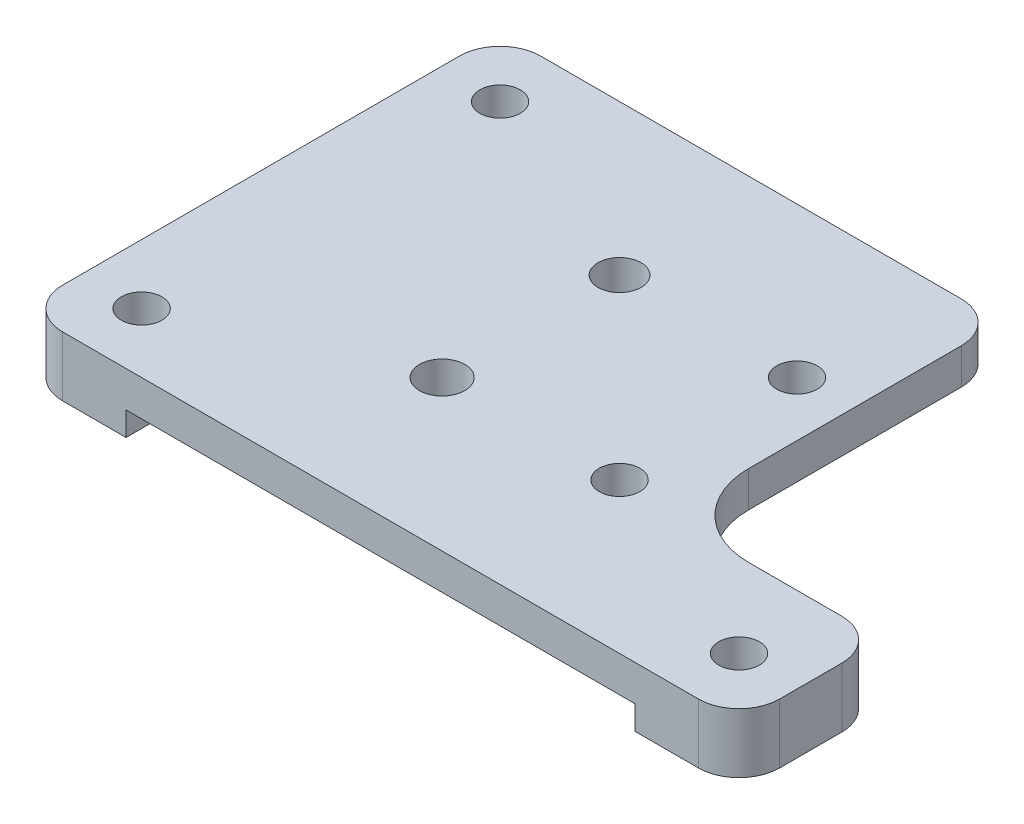
ISO-10303-21;
HEADER;
FILE_DESCRIPTION(('STEP AP214'),'2;1');
FILE_NAME('part.step','',(''),(''),'','','');
FILE_SCHEMA(('AUTOMOTIVE_DESIGN { 1 0 10303 214 1 1 1 1 }'));
ENDSEC;
DATA;
#1=APPLICATION_CONTEXT('core data for automotive mechanical design processes');
#2=APPLICATION_PROTOCOL_DEFINITION('international standard','automotive_design',2000,#1);
#3=PRODUCT_CONTEXT('',#1,'mechanical');
#4=PRODUCT('Part','Part','',(#3));
#5=PRODUCT_RELATED_PRODUCT_CATEGORY('part','',(#4));
#6=PRODUCT_DEFINITION_FORMATION('','',#4);
#7=PRODUCT_DEFINITION_CONTEXT('part definition',#1,'design');
#8=PRODUCT_DEFINITION('design','',#6,#7);
#9=PRODUCT_DEFINITION_SHAPE('','',#8);
#10=(LENGTH_UNIT() NAMED_UNIT(*) SI_UNIT(.MILLI.,.METRE.));
#11=(NAMED_UNIT(*) PLANE_ANGLE_UNIT() SI_UNIT($,.RADIAN.));
#12=(NAMED_UNIT(*) SI_UNIT($,.STERADIAN.) SOLID_ANGLE_UNIT());
#13=UNCERTAINTY_MEASURE_WITH_UNIT(LENGTH_MEASURE(1.E-05),#10,'distance_accuracy_value','');
#14=(GEOMETRIC_REPRESENTATION_CONTEXT(3) GLOBAL_UNCERTAINTY_ASSIGNED_CONTEXT((#13)) GLOBAL_UNIT_ASSIGNED_CONTEXT((#10,
#11,#12)) REPRESENTATION_CONTEXT('',''));
#15=CARTESIAN_POINT('',(0.,0.,0.));
#16=DIRECTION('',(0.,0.,1.));
#17=DIRECTION('',(1.,0.,0.));
#18=AXIS2_PLACEMENT_3D('',#15,#16,#17);
#19=CARTESIAN_POINT('',(0.,0.,0.));
#20=DIRECTION('',(0.,1.,0.));
#21=DIRECTION('',(0.,0.,1.));
#22=AXIS2_PLACEMENT_3D('',#19,#20,#21);
#23=PLANE('',#22);
#24=CARTESIAN_POINT('',(-7.425,0.,-7.425));
#25=DIRECTION('',(0.,1.,0.));
#26=DIRECTION('',(0.,0.,1.));
#27=AXIS2_PLACEMENT_3D('',#24,#25,#26);
#28=CIRCLE('',#27,1.8);
#29=CARTESIAN_POINT('',(-7.425,0.,-5.625));
#30=VERTEX_POINT('',#29);
#31=EDGE_CURVE('E811',#30,#30,#28,.T.);
#32=ORIENTED_EDGE('',*,*,#31,.T.);
#33=EDGE_LOOP('',(#32));
#34=FACE_BOUND('',#33,.T.);
#35=CARTESIAN_POINT('',(-7.425,0.,7.425));
#36=DIRECTION('',(0.,1.,0.));
#37=DIRECTION('',(0.,0.,1.));
#38=AXIS2_PLACEMENT_3D('',#35,#36,#37);
#39=CIRCLE('',#38,1.9);
#40=CARTESIAN_POINT('',(-7.425,0.,9.325));
#41=VERTEX_POINT('',#40);
#42=EDGE_CURVE('E805',#41,#41,#39,.T.);
#43=ORIENTED_EDGE('',*,*,#42,.T.);
#44=EDGE_LOOP('',(#43));
#45=FACE_BOUND('',#44,.T.);
#46=CARTESIAN_POINT('',(7.425,0.,-7.425));
#47=DIRECTION('',(0.,1.,0.));
#48=DIRECTION('',(0.,0.,1.));
#49=AXIS2_PLACEMENT_3D('',#46,#47,#48);
#50=CIRCLE('',#49,1.7);
#51=CARTESIAN_POINT('',(7.425,0.,-5.725));
#52=VERTEX_POINT('',#51);
#53=EDGE_CURVE('E290',#52,#52,#50,.T.);
#54=ORIENTED_EDGE('',*,*,#53,.T.);
#55=EDGE_LOOP('',(#54));
#56=FACE_BOUND('',#55,.T.);
#57=CARTESIAN_POINT('',(7.425,0.,7.425));
#58=DIRECTION('',(0.,1.,0.));
#59=DIRECTION('',(0.,0.,1.));
#60=AXIS2_PLACEMENT_3D('',#57,#58,#59);
#61=CIRCLE('',#60,1.7);
#62=CARTESIAN_POINT('',(7.425,0.,9.125));
#63=VERTEX_POINT('',#62);
#64=EDGE_CURVE('E337',#63,#63,#61,.T.);
#65=ORIENTED_EDGE('',*,*,#64,.T.);
#66=EDGE_LOOP('',(#65));
#67=FACE_BOUND('',#66,.T.);
#68=DIRECTION('',(1.,0.,0.));
#69=VECTOR('',#68,1.);
#70=CARTESIAN_POINT('',(0.,0.,-20.));
#71=LINE('',#70,#69);
#72=CARTESIAN_POINT('',(-21.3,0.,-20.));
#73=VERTEX_POINT('',#72);
#74=CARTESIAN_POINT('',(8.6,0.,-20.));
#75=VERTEX_POINT('',#74);
#76=EDGE_CURVE('E284',#73,#75,#71,.T.);
#77=ORIENTED_EDGE('',*,*,#76,.T.);
#78=CARTESIAN_POINT('',(8.6,0.,-16.6));
#79=DIRECTION('',(0.,1.,0.));
#80=DIRECTION('',(0.,0.,1.));
#81=AXIS2_PLACEMENT_3D('',#78,#79,#80);
#82=CIRCLE('',#81,3.4);
#83=CARTESIAN_POINT('',(12.,0.,-16.6));
#84=VERTEX_POINT('',#83);
#85=EDGE_CURVE('E362',#75,#84,#82,.F.);
#86=ORIENTED_EDGE('',*,*,#85,.T.);
#87=DIRECTION('',(0.,0.,-1.));
#88=VECTOR('',#87,1.);
#89=CARTESIAN_POINT('',(12.,0.,0.));
#90=LINE('',#89,#88);
#91=CARTESIAN_POINT('',(12.,0.,1.20000000000001));
#92=VERTEX_POINT('',#91);
#93=EDGE_CURVE('E215',#92,#84,#90,.T.);
#94=ORIENTED_EDGE('',*,*,#93,.F.);
#95=CARTESIAN_POINT('',(18.8,0.,1.20000000000001));
#96=DIRECTION('',(0.,1.,0.));
#97=DIRECTION('',(0.,0.,1.));
#98=AXIS2_PLACEMENT_3D('',#95,#96,#97);
#99=CIRCLE('',#98,6.8);
#100=CARTESIAN_POINT('',(18.8,0.,8.00000000000001));
#101=VERTEX_POINT('',#100);
#102=EDGE_CURVE('E211',#92,#101,#99,.T.);
#103=ORIENTED_EDGE('',*,*,#102,.T.);
#104=DIRECTION('',(1.,0.,0.));
#105=VECTOR('',#104,1.);
#106=CARTESIAN_POINT('',(0.,0.,8.00000000000001));
#107=LINE('',#106,#105);
#108=CARTESIAN_POINT('',(21.3,0.,8.00000000000001));
#109=VERTEX_POINT('',#108);
#110=EDGE_CURVE('E203',#101,#109,#107,.T.);
#111=ORIENTED_EDGE('',*,*,#110,.T.);
#112=DIRECTION('',(0.,0.,-1.));
#113=VECTOR('',#112,1.);
#114=CARTESIAN_POINT('',(21.3,0.,20.));
#115=LINE('',#114,#113);
#116=CARTESIAN_POINT('',(21.3,0.,20.));
#117=VERTEX_POINT('',#116);
#118=EDGE_CURVE('E208',#117,#109,#115,.T.);
#119=ORIENTED_EDGE('',*,*,#118,.F.);
#120=DIRECTION('',(1.,0.,0.));
#121=VECTOR('',#120,1.);
#122=CARTESIAN_POINT('',(0.,0.,20.));
#123=LINE('',#122,#121);
#124=CARTESIAN_POINT('',(-21.3,0.,20.));
#125=VERTEX_POINT('',#124);
#126=EDGE_CURVE('E216',#125,#117,#123,.T.);
#127=ORIENTED_EDGE('',*,*,#126,.F.);
#128=DIRECTION('',(0.,0.,-1.));
#129=VECTOR('',#128,1.);
#130=CARTESIAN_POINT('',(-21.3,0.,20.));
#131=LINE('',#130,#129);
#132=EDGE_CURVE('E260',#125,#73,#131,.T.);
#133=ORIENTED_EDGE('',*,*,#132,.T.);
#134=EDGE_LOOP('',(#77,#86,#94,#103,#111,#119,#127,#133));
#135=FACE_BOUND('',#134,.T.);
#136=ADVANCED_FACE('F89',(#34,#45,#56,#67,#135),#23,.F.);
#137=CARTESIAN_POINT('',(0.,3.,-20.));
#138=DIRECTION('',(0.,0.,-1.));
#139=DIRECTION('',(-1.,0.,0.));
#140=AXIS2_PLACEMENT_3D('',#137,#138,#139);
#141=PLANE('',#140);
#142=DIRECTION('',(1.,0.,0.));
#143=VECTOR('',#142,1.);
#144=CARTESIAN_POINT('',(0.,3.,-20.));
#145=LINE('',#144,#143);
#146=CARTESIAN_POINT('',(-26.6,3.,-20.));
#147=VERTEX_POINT('',#146);
#148=CARTESIAN_POINT('',(8.6,3.,-20.));
#149=VERTEX_POINT('',#148);
#150=EDGE_CURVE('E285',#147,#149,#145,.T.);
#151=ORIENTED_EDGE('',*,*,#150,.T.);
#152=DIRECTION('',(0.,-1.,0.));
#153=VECTOR('',#152,1.);
#154=CARTESIAN_POINT('',(8.6,0.,-20.));
#155=LINE('',#154,#153);
#156=EDGE_CURVE('E358',#149,#75,#155,.T.);
#157=ORIENTED_EDGE('',*,*,#156,.T.);
#158=ORIENTED_EDGE('',*,*,#76,.F.);
#159=DIRECTION('',(0.,1.,0.));
#160=VECTOR('',#159,1.);
#161=CARTESIAN_POINT('',(-21.3,-2.,-20.));
#162=LINE('',#161,#160);
#163=CARTESIAN_POINT('',(-21.3,-2.,-20.));
#164=VERTEX_POINT('',#163);
#165=EDGE_CURVE('E281',#164,#73,#162,.T.);
#166=ORIENTED_EDGE('',*,*,#165,.F.);
#167=DIRECTION('',(1.,0.,0.));
#168=VECTOR('',#167,1.);
#169=CARTESIAN_POINT('',(-30.,-2.,-20.));
#170=LINE('',#169,#168);
#171=CARTESIAN_POINT('',(-26.6,-2.,-20.));
#172=VERTEX_POINT('',#171);
#173=EDGE_CURVE('E261',#172,#164,#170,.T.);
#174=ORIENTED_EDGE('',*,*,#173,.F.);
#175=DIRECTION('',(0.,-1.,0.));
#176=VECTOR('',#175,1.);
#177=CARTESIAN_POINT('',(-26.6,3.,-20.));
#178=LINE('',#177,#176);
#179=EDGE_CURVE('E355',#172,#147,#178,.F.);
#180=ORIENTED_EDGE('',*,*,#179,.T.);
#181=EDGE_LOOP('',(#151,#157,#158,#166,#174,#180));
#182=FACE_BOUND('',#181,.T.);
#183=ADVANCED_FACE('F447',(#182),#141,.T.);
#184=CARTESIAN_POINT('',(-30.,3.,0.));
#185=DIRECTION('',(1.,0.,0.));
#186=DIRECTION('',(0.,0.,-1.));
#187=AXIS2_PLACEMENT_3D('',#184,#185,#186);
#188=PLANE('',#187);
#189=DIRECTION('',(0.,0.,1.));
#190=VECTOR('',#189,1.);
#191=CARTESIAN_POINT('',(-30.,3.,0.));
#192=LINE('',#191,#190);
#193=CARTESIAN_POINT('',(-30.,3.,-16.6));
#194=VERTEX_POINT('',#193);
#195=CARTESIAN_POINT('',(-30.,3.,16.6));
#196=VERTEX_POINT('',#195);
#197=EDGE_CURVE('E289',#194,#196,#192,.T.);
#198=ORIENTED_EDGE('',*,*,#197,.F.);
#199=DIRECTION('',(0.,-1.,0.));
#200=VECTOR('',#199,1.);
#201=CARTESIAN_POINT('',(-30.,-2.,-16.6));
#202=LINE('',#201,#200);
#203=CARTESIAN_POINT('',(-30.,-2.,-16.6));
#204=VERTEX_POINT('',#203);
#205=EDGE_CURVE('E386',#194,#204,#202,.T.);
#206=ORIENTED_EDGE('',*,*,#205,.T.);
#207=DIRECTION('',(0.,0.,-1.));
#208=VECTOR('',#207,1.);
#209=CARTESIAN_POINT('',(-30.,-2.,20.));
#210=LINE('',#209,#208);
#211=CARTESIAN_POINT('',(-30.,-2.,16.6));
#212=VERTEX_POINT('',#211);
#213=EDGE_CURVE('E271',#212,#204,#210,.T.);
#214=ORIENTED_EDGE('',*,*,#213,.F.);
#215=DIRECTION('',(0.,-1.,0.));
#216=VECTOR('',#215,1.);
#217=CARTESIAN_POINT('',(-30.,3.,16.6));
#218=LINE('',#217,#216);
#219=EDGE_CURVE('E383',#212,#196,#218,.F.);
#220=ORIENTED_EDGE('',*,*,#219,.T.);
#221=EDGE_LOOP('',(#198,#206,#214,#220));
#222=FACE_BOUND('',#221,.T.);
#223=ADVANCED_FACE('F438',(#222),#188,.F.);
#224=CARTESIAN_POINT('',(0.,3.,20.));
#225=DIRECTION('',(0.,0.,-1.));
#226=DIRECTION('',(-1.,0.,0.));
#227=AXIS2_PLACEMENT_3D('',#224,#225,#226);
#228=PLANE('',#227);
#229=DIRECTION('',(1.,0.,0.));
#230=VECTOR('',#229,1.);
#231=CARTESIAN_POINT('',(0.,3.,20.));
#232=LINE('',#231,#230);
#233=CARTESIAN_POINT('',(-26.6,3.,20.));
#234=VERTEX_POINT('',#233);
#235=CARTESIAN_POINT('',(26.6,3.,20.));
#236=VERTEX_POINT('',#235);
#237=EDGE_CURVE('E294',#234,#236,#232,.T.);
#238=ORIENTED_EDGE('',*,*,#237,.F.);
#239=DIRECTION('',(0.,-1.,0.));
#240=VECTOR('',#239,1.);
#241=CARTESIAN_POINT('',(-26.6,3.,20.));
#242=LINE('',#241,#240);
#243=CARTESIAN_POINT('',(-26.6,-2.,20.));
#244=VERTEX_POINT('',#243);
#245=EDGE_CURVE('E399',#234,#244,#242,.T.);
#246=ORIENTED_EDGE('',*,*,#245,.T.);
#247=DIRECTION('',(1.,0.,0.));
#248=VECTOR('',#247,1.);
#249=CARTESIAN_POINT('',(-30.,-2.,20.));
#250=LINE('',#249,#248);
#251=CARTESIAN_POINT('',(-21.3,-2.,20.));
#252=VERTEX_POINT('',#251);
#253=EDGE_CURVE('E268',#244,#252,#250,.T.);
#254=ORIENTED_EDGE('',*,*,#253,.T.);
#255=DIRECTION('',(0.,1.,0.));
#256=VECTOR('',#255,1.);
#257=CARTESIAN_POINT('',(-21.3,-2.,20.));
#258=LINE('',#257,#256);
#259=EDGE_CURVE('E275',#252,#125,#258,.T.);
#260=ORIENTED_EDGE('',*,*,#259,.T.);
#261=ORIENTED_EDGE('',*,*,#126,.T.);
#262=DIRECTION('',(0.,1.,0.));
#263=VECTOR('',#262,1.);
#264=CARTESIAN_POINT('',(21.3,-2.,20.));
#265=LINE('',#264,#263);
#266=CARTESIAN_POINT('',(21.3,-2.,20.));
#267=VERTEX_POINT('',#266);
#268=EDGE_CURVE('E229',#267,#117,#265,.T.);
#269=ORIENTED_EDGE('',*,*,#268,.F.);
#270=DIRECTION('',(-1.,0.,0.));
#271=VECTOR('',#270,1.);
#272=CARTESIAN_POINT('',(30.,-2.,20.));
#273=LINE('',#272,#271);
#274=CARTESIAN_POINT('',(26.6,-2.,20.));
#275=VERTEX_POINT('',#274);
#276=EDGE_CURVE('E248',#275,#267,#273,.T.);
#277=ORIENTED_EDGE('',*,*,#276,.F.);
#278=DIRECTION('',(0.,-1.,0.));
#279=VECTOR('',#278,1.);
#280=CARTESIAN_POINT('',(26.6,3.,20.));
#281=LINE('',#280,#279);
#282=EDGE_CURVE('E396',#275,#236,#281,.F.);
#283=ORIENTED_EDGE('',*,*,#282,.T.);
#284=EDGE_LOOP('',(#238,#246,#254,#260,#261,#269,#277,#283));
#285=FACE_BOUND('',#284,.T.);
#286=ADVANCED_FACE('F420',(#285),#228,.F.);
#287=CARTESIAN_POINT('',(30.,3.,0.));
#288=DIRECTION('',(-1.,0.,0.));
#289=DIRECTION('',(0.,0.,1.));
#290=AXIS2_PLACEMENT_3D('',#287,#288,#289);
#291=PLANE('',#290);
#292=DIRECTION('',(0.,0.,-1.));
#293=VECTOR('',#292,1.);
#294=CARTESIAN_POINT('',(30.,-2.,20.));
#295=LINE('',#294,#293);
#296=CARTESIAN_POINT('',(30.,-2.,16.6));
#297=VERTEX_POINT('',#296);
#298=CARTESIAN_POINT('',(30.,-2.,11.4));
#299=VERTEX_POINT('',#298);
#300=EDGE_CURVE('E228',#297,#299,#295,.T.);
#301=ORIENTED_EDGE('',*,*,#300,.T.);
#302=DIRECTION('',(0.,-1.,0.));
#303=VECTOR('',#302,1.);
#304=CARTESIAN_POINT('',(30.,3.,11.4));
#305=LINE('',#304,#303);
#306=CARTESIAN_POINT('',(30.,3.,11.4));
#307=VERTEX_POINT('',#306);
#308=EDGE_CURVE('E12',#299,#307,#305,.F.);
#309=ORIENTED_EDGE('',*,*,#308,.T.);
#310=DIRECTION('',(0.,0.,-1.));
#311=VECTOR('',#310,1.);
#312=CARTESIAN_POINT('',(30.,3.,0.));
#313=LINE('',#312,#311);
#314=CARTESIAN_POINT('',(30.,3.,16.6));
#315=VERTEX_POINT('',#314);
#316=EDGE_CURVE('E298',#315,#307,#313,.T.);
#317=ORIENTED_EDGE('',*,*,#316,.F.);
#318=DIRECTION('',(0.,-1.,0.));
#319=VECTOR('',#318,1.);
#320=CARTESIAN_POINT('',(30.,3.,16.6));
#321=LINE('',#320,#319);
#322=EDGE_CURVE('E98',#315,#297,#321,.T.);
#323=ORIENTED_EDGE('',*,*,#322,.T.);
#324=EDGE_LOOP('',(#301,#309,#317,#323));
#325=FACE_BOUND('',#324,.T.);
#326=ADVANCED_FACE('F412',(#325),#291,.F.);
#327=CARTESIAN_POINT('',(0.,3.,8.00000000000001));
#328=DIRECTION('',(0.,0.,-1.));
#329=DIRECTION('',(-1.,0.,0.));
#330=AXIS2_PLACEMENT_3D('',#327,#328,#329);
#331=PLANE('',#330);
#332=DIRECTION('',(1.,0.,0.));
#333=VECTOR('',#332,1.);
#334=CARTESIAN_POINT('',(0.,3.,8.00000000000001));
#335=LINE('',#334,#333);
#336=CARTESIAN_POINT('',(18.8,3.,8.00000000000001));
#337=VERTEX_POINT('',#336);
#338=CARTESIAN_POINT('',(26.6,3.,8.00000000000001));
#339=VERTEX_POINT('',#338);
#340=EDGE_CURVE('E302',#337,#339,#335,.T.);
#341=ORIENTED_EDGE('',*,*,#340,.T.);
#342=DIRECTION('',(0.,-1.,0.));
#343=VECTOR('',#342,1.);
#344=CARTESIAN_POINT('',(26.6,-2.,8.00000000000001));
#345=LINE('',#344,#343);
#346=CARTESIAN_POINT('',(26.6,-2.,8.00000000000001));
#347=VERTEX_POINT('',#346);
#348=EDGE_CURVE('E403',#339,#347,#345,.T.);
#349=ORIENTED_EDGE('',*,*,#348,.T.);
#350=DIRECTION('',(-1.,0.,0.));
#351=VECTOR('',#350,1.);
#352=CARTESIAN_POINT('',(30.,-2.,8.00000000000001));
#353=LINE('',#352,#351);
#354=CARTESIAN_POINT('',(21.3,-2.,8.00000000000001));
#355=VERTEX_POINT('',#354);
#356=EDGE_CURVE('E223',#347,#355,#353,.T.);
#357=ORIENTED_EDGE('',*,*,#356,.T.);
#358=DIRECTION('',(0.,1.,0.));
#359=VECTOR('',#358,1.);
#360=CARTESIAN_POINT('',(21.3,-2.,8.00000000000001));
#361=LINE('',#360,#359);
#362=EDGE_CURVE('E219',#355,#109,#361,.T.);
#363=ORIENTED_EDGE('',*,*,#362,.T.);
#364=ORIENTED_EDGE('',*,*,#110,.F.);
#365=DIRECTION('',(0.,-1.,0.));
#366=VECTOR('',#365,1.);
#367=CARTESIAN_POINT('',(18.8,3.,8.00000000000001));
#368=LINE('',#367,#366);
#369=EDGE_CURVE('E347',#101,#337,#368,.F.);
#370=ORIENTED_EDGE('',*,*,#369,.T.);
#371=EDGE_LOOP('',(#341,#349,#357,#363,#364,#370));
#372=FACE_BOUND('',#371,.T.);
#373=ADVANCED_FACE('F221',(#372),#331,.T.);
#374=CARTESIAN_POINT('',(7.425,3.,7.425));
#375=DIRECTION('',(0.,-1.,0.));
#376=DIRECTION('',(0.,0.,-1.));
#377=AXIS2_PLACEMENT_3D('',#374,#375,#376);
#378=CYLINDRICAL_SURFACE('',#377,1.7);
#379=CARTESIAN_POINT('',(7.425,3.,7.425));
#380=DIRECTION('',(0.,1.,0.));
#381=DIRECTION('',(0.,0.,1.));
#382=AXIS2_PLACEMENT_3D('',#379,#380,#381);
#383=CIRCLE('',#382,1.7);
#384=CARTESIAN_POINT('',(7.425,3.,9.125));
#385=VERTEX_POINT('',#384);
#386=EDGE_CURVE('E321',#385,#385,#383,.T.);
#387=ORIENTED_EDGE('',*,*,#386,.T.);
#388=EDGE_LOOP('',(#387));
#389=FACE_BOUND('',#388,.T.);
#390=ORIENTED_EDGE('',*,*,#64,.F.);
#391=EDGE_LOOP('',(#390));
#392=FACE_BOUND('',#391,.T.);
#393=ADVANCED_FACE('F495',(#389,#392),#378,.F.);
#394=CARTESIAN_POINT('',(-25.,3.,-15.));
#395=DIRECTION('',(0.,-1.,0.));
#396=DIRECTION('',(0.,0.,-1.));
#397=AXIS2_PLACEMENT_3D('',#394,#395,#396);
#398=CYLINDRICAL_SURFACE('',#397,1.7);
#399=CARTESIAN_POINT('',(-25.,3.,-15.));
#400=DIRECTION('',(0.,1.,0.));
#401=DIRECTION('',(0.,0.,1.));
#402=AXIS2_PLACEMENT_3D('',#399,#400,#401);
#403=CIRCLE('',#402,1.7);
#404=CARTESIAN_POINT('',(-25.,3.,-13.3));
#405=VERTEX_POINT('',#404);
#406=EDGE_CURVE('E317',#405,#405,#403,.T.);
#407=ORIENTED_EDGE('',*,*,#406,.T.);
#408=EDGE_LOOP('',(#407));
#409=FACE_BOUND('',#408,.T.);
#410=CARTESIAN_POINT('',(-25.,-2.,-15.));
#411=DIRECTION('',(0.,-1.,0.));
#412=DIRECTION('',(0.,0.,-1.));
#413=AXIS2_PLACEMENT_3D('',#410,#411,#412);
#414=CIRCLE('',#413,1.7);
#415=CARTESIAN_POINT('',(-25.,-2.,-16.7));
#416=VERTEX_POINT('',#415);
#417=EDGE_CURVE('E240',#416,#416,#414,.T.);
#418=ORIENTED_EDGE('',*,*,#417,.T.);
#419=EDGE_LOOP('',(#418));
#420=FACE_BOUND('',#419,.T.);
#421=ADVANCED_FACE('F498',(#409,#420),#398,.F.);
#422=CARTESIAN_POINT('',(25.,3.,15.));
#423=DIRECTION('',(0.,-1.,0.));
#424=DIRECTION('',(0.,0.,-1.));
#425=AXIS2_PLACEMENT_3D('',#422,#423,#424);
#426=CYLINDRICAL_SURFACE('',#425,1.7);
#427=CARTESIAN_POINT('',(25.,3.,15.));
#428=DIRECTION('',(0.,1.,0.));
#429=DIRECTION('',(0.,0.,1.));
#430=AXIS2_PLACEMENT_3D('',#427,#428,#429);
#431=CIRCLE('',#430,1.7);
#432=CARTESIAN_POINT('',(25.,3.,16.7));
#433=VERTEX_POINT('',#432);
#434=EDGE_CURVE('E313',#433,#433,#431,.T.);
#435=ORIENTED_EDGE('',*,*,#434,.T.);
#436=EDGE_LOOP('',(#435));
#437=FACE_BOUND('',#436,.T.);
#438=CARTESIAN_POINT('',(25.,-2.,15.));
#439=DIRECTION('',(0.,-1.,0.));
#440=DIRECTION('',(0.,0.,-1.));
#441=AXIS2_PLACEMENT_3D('',#438,#439,#440);
#442=CIRCLE('',#441,1.7);
#443=CARTESIAN_POINT('',(25.,-2.,13.3));
#444=VERTEX_POINT('',#443);
#445=EDGE_CURVE('E235',#444,#444,#442,.T.);
#446=ORIENTED_EDGE('',*,*,#445,.T.);
#447=EDGE_LOOP('',(#446));
#448=FACE_BOUND('',#447,.T.);
#449=ADVANCED_FACE('F502',(#437,#448),#426,.F.);
#450=CARTESIAN_POINT('',(-25.,3.,15.));
#451=DIRECTION('',(0.,-1.,0.));
#452=DIRECTION('',(0.,0.,-1.));
#453=AXIS2_PLACEMENT_3D('',#450,#451,#452);
#454=CYLINDRICAL_SURFACE('',#453,1.7);
#455=CARTESIAN_POINT('',(-25.,3.,15.));
#456=DIRECTION('',(0.,1.,0.));
#457=DIRECTION('',(0.,0.,1.));
#458=AXIS2_PLACEMENT_3D('',#455,#456,#457);
#459=CIRCLE('',#458,1.7);
#460=CARTESIAN_POINT('',(-25.,3.,16.7));
#461=VERTEX_POINT('',#460);
#462=EDGE_CURVE('E309',#461,#461,#459,.T.);
#463=ORIENTED_EDGE('',*,*,#462,.T.);
#464=EDGE_LOOP('',(#463));
#465=FACE_BOUND('',#464,.T.);
#466=CARTESIAN_POINT('',(-25.,-2.,15.));
#467=DIRECTION('',(0.,-1.,0.));
#468=DIRECTION('',(0.,0.,-1.));
#469=AXIS2_PLACEMENT_3D('',#466,#467,#468);
#470=CIRCLE('',#469,1.7);
#471=CARTESIAN_POINT('',(-25.,-2.,13.3));
#472=VERTEX_POINT('',#471);
#473=EDGE_CURVE('E256',#472,#472,#470,.T.);
#474=ORIENTED_EDGE('',*,*,#473,.T.);
#475=EDGE_LOOP('',(#474));
#476=FACE_BOUND('',#475,.T.);
#477=ADVANCED_FACE('F506',(#465,#476),#454,.F.);
#478=CARTESIAN_POINT('',(12.,3.,0.));
#479=DIRECTION('',(-1.,0.,0.));
#480=DIRECTION('',(0.,0.,1.));
#481=AXIS2_PLACEMENT_3D('',#478,#479,#480);
#482=PLANE('',#481);
#483=ORIENTED_EDGE('',*,*,#93,.T.);
#484=DIRECTION('',(0.,-1.,0.));
#485=VECTOR('',#484,1.);
#486=CARTESIAN_POINT('',(12.,3.,-16.6));
#487=LINE('',#486,#485);
#488=CARTESIAN_POINT('',(12.,3.,-16.6));
#489=VERTEX_POINT('',#488);
#490=EDGE_CURVE('E365',#84,#489,#487,.F.);
#491=ORIENTED_EDGE('',*,*,#490,.T.);
#492=DIRECTION('',(0.,0.,-1.));
#493=VECTOR('',#492,1.);
#494=CARTESIAN_POINT('',(12.,3.,0.));
#495=LINE('',#494,#493);
#496=CARTESIAN_POINT('',(12.,3.,1.20000000000001));
#497=VERTEX_POINT('',#496);
#498=EDGE_CURVE('E305',#497,#489,#495,.T.);
#499=ORIENTED_EDGE('',*,*,#498,.F.);
#500=DIRECTION('',(0.,-1.,0.));
#501=VECTOR('',#500,1.);
#502=CARTESIAN_POINT('',(12.,3.,1.20000000000001));
#503=LINE('',#502,#501);
#504=EDGE_CURVE('E329',#497,#92,#503,.T.);
#505=ORIENTED_EDGE('',*,*,#504,.T.);
#506=EDGE_LOOP('',(#483,#491,#499,#505));
#507=FACE_BOUND('',#506,.T.);
#508=ADVANCED_FACE('F458',(#507),#482,.F.);
#509=CARTESIAN_POINT('',(7.425,3.,-7.425));
#510=DIRECTION('',(0.,-1.,0.));
#511=DIRECTION('',(0.,0.,-1.));
#512=AXIS2_PLACEMENT_3D('',#509,#510,#511);
#513=CYLINDRICAL_SURFACE('',#512,1.7);
#514=CARTESIAN_POINT('',(7.425,3.,-7.425));
#515=DIRECTION('',(0.,1.,0.));
#516=DIRECTION('',(0.,0.,1.));
#517=AXIS2_PLACEMENT_3D('',#514,#515,#516);
#518=CIRCLE('',#517,1.7);
#519=CARTESIAN_POINT('',(7.425,3.,-5.725));
#520=VERTEX_POINT('',#519);
#521=EDGE_CURVE('E325',#520,#520,#518,.T.);
#522=ORIENTED_EDGE('',*,*,#521,.T.);
#523=EDGE_LOOP('',(#522));
#524=FACE_BOUND('',#523,.T.);
#525=ORIENTED_EDGE('',*,*,#53,.F.);
#526=EDGE_LOOP('',(#525));
#527=FACE_BOUND('',#526,.T.);
#528=ADVANCED_FACE('F491',(#524,#527),#513,.F.);
#529=CARTESIAN_POINT('',(0.,3.,0.));
#530=DIRECTION('',(0.,1.,0.));
#531=DIRECTION('',(0.,0.,1.));
#532=AXIS2_PLACEMENT_3D('',#529,#530,#531);
#533=PLANE('',#532);
#534=CARTESIAN_POINT('',(-7.425,3.,-7.425));
#535=DIRECTION('',(0.,1.,0.));
#536=DIRECTION('',(0.,0.,1.));
#537=AXIS2_PLACEMENT_3D('',#534,#535,#536);
#538=CIRCLE('',#537,1.8);
#539=CARTESIAN_POINT('',(-7.425,3.,-5.625));
#540=VERTEX_POINT('',#539);
#541=EDGE_CURVE('E798',#540,#540,#538,.T.);
#542=ORIENTED_EDGE('',*,*,#541,.F.);
#543=EDGE_LOOP('',(#542));
#544=FACE_BOUND('',#543,.T.);
#545=CARTESIAN_POINT('',(-7.425,3.,7.425));
#546=DIRECTION('',(0.,1.,0.));
#547=DIRECTION('',(0.,0.,1.));
#548=AXIS2_PLACEMENT_3D('',#545,#546,#547);
#549=CIRCLE('',#548,1.9);
#550=CARTESIAN_POINT('',(-7.425,3.,9.325));
#551=VERTEX_POINT('',#550);
#552=EDGE_CURVE('E801',#551,#551,#549,.T.);
#553=ORIENTED_EDGE('',*,*,#552,.F.);
#554=EDGE_LOOP('',(#553));
#555=FACE_BOUND('',#554,.T.);
#556=ORIENTED_EDGE('',*,*,#498,.T.);
#557=CARTESIAN_POINT('',(8.6,3.,-16.6));
#558=DIRECTION('',(0.,1.,0.));
#559=DIRECTION('',(0.,0.,1.));
#560=AXIS2_PLACEMENT_3D('',#557,#558,#559);
#561=CIRCLE('',#560,3.4);
#562=EDGE_CURVE('E380',#489,#149,#561,.T.);
#563=ORIENTED_EDGE('',*,*,#562,.T.);
#564=ORIENTED_EDGE('',*,*,#150,.F.);
#565=CARTESIAN_POINT('',(-26.6,3.,-16.6));
#566=DIRECTION('',(0.,1.,0.));
#567=DIRECTION('',(0.,0.,1.));
#568=AXIS2_PLACEMENT_3D('',#565,#566,#567);
#569=CIRCLE('',#568,3.4);
#570=EDGE_CURVE('E377',#147,#194,#569,.T.);
#571=ORIENTED_EDGE('',*,*,#570,.T.);
#572=ORIENTED_EDGE('',*,*,#197,.T.);
#573=CARTESIAN_POINT('',(-26.6,3.,16.6));
#574=DIRECTION('',(0.,1.,0.));
#575=DIRECTION('',(0.,0.,1.));
#576=AXIS2_PLACEMENT_3D('',#573,#574,#575);
#577=CIRCLE('',#576,3.4);
#578=EDGE_CURVE('E374',#196,#234,#577,.T.);
#579=ORIENTED_EDGE('',*,*,#578,.T.);
#580=ORIENTED_EDGE('',*,*,#237,.T.);
#581=CARTESIAN_POINT('',(26.6,3.,16.6));
#582=DIRECTION('',(0.,1.,0.));
#583=DIRECTION('',(0.,0.,1.));
#584=AXIS2_PLACEMENT_3D('',#581,#582,#583);
#585=CIRCLE('',#584,3.4);
#586=EDGE_CURVE('E368',#236,#315,#585,.T.);
#587=ORIENTED_EDGE('',*,*,#586,.T.);
#588=ORIENTED_EDGE('',*,*,#316,.T.);
#589=CARTESIAN_POINT('',(26.6,3.,11.4));
#590=DIRECTION('',(0.,1.,0.));
#591=DIRECTION('',(0.,0.,1.));
#592=AXIS2_PLACEMENT_3D('',#589,#590,#591);
#593=CIRCLE('',#592,3.4);
#594=EDGE_CURVE('E371',#307,#339,#593,.T.);
#595=ORIENTED_EDGE('',*,*,#594,.T.);
#596=ORIENTED_EDGE('',*,*,#340,.F.);
#597=CARTESIAN_POINT('',(18.8,3.,1.20000000000001));
#598=DIRECTION('',(0.,1.,0.));
#599=DIRECTION('',(0.,0.,1.));
#600=AXIS2_PLACEMENT_3D('',#597,#598,#599);
#601=CIRCLE('',#600,6.8);
#602=EDGE_CURVE('E352',#337,#497,#601,.F.);
#603=ORIENTED_EDGE('',*,*,#602,.T.);
#604=EDGE_LOOP('',(#556,#563,#564,#571,#572,#579,#580,#587,#588,#595,#596,#603));
#605=FACE_BOUND('',#604,.T.);
#606=ORIENTED_EDGE('',*,*,#462,.F.);
#607=EDGE_LOOP('',(#606));
#608=FACE_BOUND('',#607,.T.);
#609=ORIENTED_EDGE('',*,*,#434,.F.);
#610=EDGE_LOOP('',(#609));
#611=FACE_BOUND('',#610,.T.);
#612=ORIENTED_EDGE('',*,*,#406,.F.);
#613=EDGE_LOOP('',(#612));
#614=FACE_BOUND('',#613,.T.);
#615=ORIENTED_EDGE('',*,*,#386,.F.);
#616=EDGE_LOOP('',(#615));
#617=FACE_BOUND('',#616,.T.);
#618=ORIENTED_EDGE('',*,*,#521,.F.);
#619=EDGE_LOOP('',(#618));
#620=FACE_BOUND('',#619,.T.);
#621=ADVANCED_FACE('F422',(#544,#555,#605,#608,#611,#614,#617,#620),#533,.T.);
#622=CARTESIAN_POINT('',(18.8,3.,1.20000000000001));
#623=DIRECTION('',(0.,-1.,0.));
#624=DIRECTION('',(0.,0.,-1.));
#625=AXIS2_PLACEMENT_3D('',#622,#623,#624);
#626=CYLINDRICAL_SURFACE('',#625,6.8);
#627=ORIENTED_EDGE('',*,*,#602,.F.);
#628=ORIENTED_EDGE('',*,*,#369,.F.);
#629=ORIENTED_EDGE('',*,*,#102,.F.);
#630=ORIENTED_EDGE('',*,*,#504,.F.);
#631=EDGE_LOOP('',(#627,#628,#629,#630));
#632=FACE_BOUND('',#631,.T.);
#633=ADVANCED_FACE('F466',(#632),#626,.F.);
#634=CARTESIAN_POINT('',(0.,-2.,0.));
#635=DIRECTION('',(0.,1.,0.));
#636=DIRECTION('',(0.,0.,1.));
#637=AXIS2_PLACEMENT_3D('',#634,#635,#636);
#638=PLANE('',#637);
#639=ORIENTED_EDGE('',*,*,#213,.T.);
#640=CARTESIAN_POINT('',(-26.6,-2.,-16.6));
#641=DIRECTION('',(0.,1.,0.));
#642=DIRECTION('',(0.,0.,1.));
#643=AXIS2_PLACEMENT_3D('',#640,#641,#642);
#644=CIRCLE('',#643,3.4);
#645=EDGE_CURVE('E393',#204,#172,#644,.F.);
#646=ORIENTED_EDGE('',*,*,#645,.T.);
#647=ORIENTED_EDGE('',*,*,#173,.T.);
#648=DIRECTION('',(0.,0.,-1.));
#649=VECTOR('',#648,1.);
#650=CARTESIAN_POINT('',(-21.3,-2.,20.));
#651=LINE('',#650,#649);
#652=EDGE_CURVE('E264',#252,#164,#651,.T.);
#653=ORIENTED_EDGE('',*,*,#652,.F.);
#654=ORIENTED_EDGE('',*,*,#253,.F.);
#655=CARTESIAN_POINT('',(-26.6,-2.,16.6));
#656=DIRECTION('',(0.,1.,0.));
#657=DIRECTION('',(0.,0.,1.));
#658=AXIS2_PLACEMENT_3D('',#655,#656,#657);
#659=CIRCLE('',#658,3.4);
#660=EDGE_CURVE('E390',#244,#212,#659,.F.);
#661=ORIENTED_EDGE('',*,*,#660,.T.);
#662=EDGE_LOOP('',(#639,#646,#647,#653,#654,#661));
#663=FACE_BOUND('',#662,.T.);
#664=ORIENTED_EDGE('',*,*,#473,.F.);
#665=EDGE_LOOP('',(#664));
#666=FACE_BOUND('',#665,.T.);
#667=ORIENTED_EDGE('',*,*,#417,.F.);
#668=EDGE_LOOP('',(#667));
#669=FACE_BOUND('',#668,.T.);
#670=ADVANCED_FACE('F433',(#663,#666,#669),#638,.F.);
#671=CARTESIAN_POINT('',(-21.3,-2.,20.));
#672=DIRECTION('',(1.,0.,0.));
#673=DIRECTION('',(0.,0.,-1.));
#674=AXIS2_PLACEMENT_3D('',#671,#672,#673);
#675=PLANE('',#674);
#676=ORIENTED_EDGE('',*,*,#132,.F.);
#677=ORIENTED_EDGE('',*,*,#259,.F.);
#678=ORIENTED_EDGE('',*,*,#652,.T.);
#679=ORIENTED_EDGE('',*,*,#165,.T.);
#680=EDGE_LOOP('',(#676,#677,#678,#679));
#681=FACE_BOUND('',#680,.T.);
#682=ADVANCED_FACE('F453',(#681),#675,.T.);
#683=CARTESIAN_POINT('',(0.,-2.,0.));
#684=DIRECTION('',(0.,-1.,0.));
#685=DIRECTION('',(0.,0.,-1.));
#686=AXIS2_PLACEMENT_3D('',#683,#684,#685);
#687=PLANE('',#686);
#688=ORIENTED_EDGE('',*,*,#356,.F.);
#689=CARTESIAN_POINT('',(26.6,-2.,11.4));
#690=DIRECTION('',(0.,-1.,0.));
#691=DIRECTION('',(0.,0.,-1.));
#692=AXIS2_PLACEMENT_3D('',#689,#690,#691);
#693=CIRCLE('',#692,3.4);
#694=EDGE_CURVE('E105',#347,#299,#693,.T.);
#695=ORIENTED_EDGE('',*,*,#694,.T.);
#696=ORIENTED_EDGE('',*,*,#300,.F.);
#697=CARTESIAN_POINT('',(26.6,-2.,16.6));
#698=DIRECTION('',(0.,-1.,0.));
#699=DIRECTION('',(0.,0.,-1.));
#700=AXIS2_PLACEMENT_3D('',#697,#698,#699);
#701=CIRCLE('',#700,3.4);
#702=EDGE_CURVE('E113',#297,#275,#701,.T.);
#703=ORIENTED_EDGE('',*,*,#702,.T.);
#704=ORIENTED_EDGE('',*,*,#276,.T.);
#705=DIRECTION('',(0.,0.,-1.));
#706=VECTOR('',#705,1.);
#707=CARTESIAN_POINT('',(21.3,-2.,20.));
#708=LINE('',#707,#706);
#709=EDGE_CURVE('E242',#267,#355,#708,.T.);
#710=ORIENTED_EDGE('',*,*,#709,.T.);
#711=EDGE_LOOP('',(#688,#695,#696,#703,#704,#710));
#712=FACE_BOUND('',#711,.T.);
#713=ORIENTED_EDGE('',*,*,#445,.F.);
#714=EDGE_LOOP('',(#713));
#715=FACE_BOUND('',#714,.T.);
#716=ADVANCED_FACE('F415',(#712,#715),#687,.T.);
#717=CARTESIAN_POINT('',(21.3,-2.,20.));
#718=DIRECTION('',(1.,0.,0.));
#719=DIRECTION('',(0.,0.,-1.));
#720=AXIS2_PLACEMENT_3D('',#717,#718,#719);
#721=PLANE('',#720);
#722=ORIENTED_EDGE('',*,*,#118,.T.);
#723=ORIENTED_EDGE('',*,*,#362,.F.);
#724=ORIENTED_EDGE('',*,*,#709,.F.);
#725=ORIENTED_EDGE('',*,*,#268,.T.);
#726=EDGE_LOOP('',(#722,#723,#724,#725));
#727=FACE_BOUND('',#726,.T.);
#728=ADVANCED_FACE('F232',(#727),#721,.F.);
#729=CARTESIAN_POINT('',(8.6,3.,-16.6));
#730=DIRECTION('',(0.,1.,0.));
#731=DIRECTION('',(0.,0.,1.));
#732=AXIS2_PLACEMENT_3D('',#729,#730,#731);
#733=CYLINDRICAL_SURFACE('',#732,3.4);
#734=ORIENTED_EDGE('',*,*,#562,.F.);
#735=ORIENTED_EDGE('',*,*,#490,.F.);
#736=ORIENTED_EDGE('',*,*,#85,.F.);
#737=ORIENTED_EDGE('',*,*,#156,.F.);
#738=EDGE_LOOP('',(#734,#735,#736,#737));
#739=FACE_BOUND('',#738,.T.);
#740=ADVANCED_FACE('F462',(#739),#733,.T.);
#741=CARTESIAN_POINT('',(-26.6,3.,-16.6));
#742=DIRECTION('',(0.,1.,0.));
#743=DIRECTION('',(0.,0.,1.));
#744=AXIS2_PLACEMENT_3D('',#741,#742,#743);
#745=CYLINDRICAL_SURFACE('',#744,3.4);
#746=ORIENTED_EDGE('',*,*,#570,.F.);
#747=ORIENTED_EDGE('',*,*,#179,.F.);
#748=ORIENTED_EDGE('',*,*,#645,.F.);
#749=ORIENTED_EDGE('',*,*,#205,.F.);
#750=EDGE_LOOP('',(#746,#747,#748,#749));
#751=FACE_BOUND('',#750,.T.);
#752=ADVANCED_FACE('F442',(#751),#745,.T.);
#753=CARTESIAN_POINT('',(-26.6,3.,16.6));
#754=DIRECTION('',(0.,-1.,0.));
#755=DIRECTION('',(0.,0.,-1.));
#756=AXIS2_PLACEMENT_3D('',#753,#754,#755);
#757=CYLINDRICAL_SURFACE('',#756,3.4);
#758=ORIENTED_EDGE('',*,*,#578,.F.);
#759=ORIENTED_EDGE('',*,*,#219,.F.);
#760=ORIENTED_EDGE('',*,*,#660,.F.);
#761=ORIENTED_EDGE('',*,*,#245,.F.);
#762=EDGE_LOOP('',(#758,#759,#760,#761));
#763=FACE_BOUND('',#762,.T.);
#764=ADVANCED_FACE('F429',(#763),#757,.T.);
#765=CARTESIAN_POINT('',(26.6,3.,11.4));
#766=DIRECTION('',(0.,1.,0.));
#767=DIRECTION('',(0.,0.,1.));
#768=AXIS2_PLACEMENT_3D('',#765,#766,#767);
#769=CYLINDRICAL_SURFACE('',#768,3.4);
#770=ORIENTED_EDGE('',*,*,#594,.F.);
#771=ORIENTED_EDGE('',*,*,#308,.F.);
#772=ORIENTED_EDGE('',*,*,#694,.F.);
#773=ORIENTED_EDGE('',*,*,#348,.F.);
#774=EDGE_LOOP('',(#770,#771,#772,#773));
#775=FACE_BOUND('',#774,.T.);
#776=ADVANCED_FACE('F469',(#775),#769,.T.);
#777=CARTESIAN_POINT('',(26.6,3.,16.6));
#778=DIRECTION('',(0.,-1.,0.));
#779=DIRECTION('',(0.,0.,-1.));
#780=AXIS2_PLACEMENT_3D('',#777,#778,#779);
#781=CYLINDRICAL_SURFACE('',#780,3.4);
#782=ORIENTED_EDGE('',*,*,#586,.F.);
#783=ORIENTED_EDGE('',*,*,#282,.F.);
#784=ORIENTED_EDGE('',*,*,#702,.F.);
#785=ORIENTED_EDGE('',*,*,#322,.F.);
#786=EDGE_LOOP('',(#782,#783,#784,#785));
#787=FACE_BOUND('',#786,.T.);
#788=ADVANCED_FACE('F91',(#787),#781,.T.);
#789=CARTESIAN_POINT('',(-7.425,-7.,7.425));
#790=DIRECTION('',(0.,1.,0.));
#791=DIRECTION('',(0.,0.,1.));
#792=AXIS2_PLACEMENT_3D('',#789,#790,#791);
#793=CYLINDRICAL_SURFACE('',#792,1.9);
#794=ORIENTED_EDGE('',*,*,#552,.T.);
#795=EDGE_LOOP('',(#794));
#796=FACE_BOUND('',#795,.T.);
#797=ORIENTED_EDGE('',*,*,#42,.F.);
#798=EDGE_LOOP('',(#797));
#799=FACE_BOUND('',#798,.T.);
#800=ADVANCED_FACE('F475',(#796,#799),#793,.F.);
#801=CARTESIAN_POINT('',(-7.425,-7.,-7.425));
#802=DIRECTION('',(0.,1.,0.));
#803=DIRECTION('',(0.,0.,1.));
#804=AXIS2_PLACEMENT_3D('',#801,#802,#803);
#805=CYLINDRICAL_SURFACE('',#804,1.8);
#806=ORIENTED_EDGE('',*,*,#541,.T.);
#807=EDGE_LOOP('',(#806));
#808=FACE_BOUND('',#807,.T.);
#809=ORIENTED_EDGE('',*,*,#31,.F.);
#810=EDGE_LOOP('',(#809));
#811=FACE_BOUND('',#810,.T.);
#812=ADVANCED_FACE('F556',(#808,#811),#805,.F.);
#813=CLOSED_SHELL('',(#136,#183,#223,#286,#326,#373,#393,#421,#449,#477,#508,#528,#621,#633,
#670,#682,#716,#728,#740,#752,#764,#776,#788,#800,#812));
#814=MANIFOLD_SOLID_BREP('B2',#813);
#815=ADVANCED_BREP_SHAPE_REPRESENTATION('',(#18,#814),#14);
#816=SHAPE_DEFINITION_REPRESENTATION(#9,#815);
ENDSEC;
END-ISO-10303-21;
